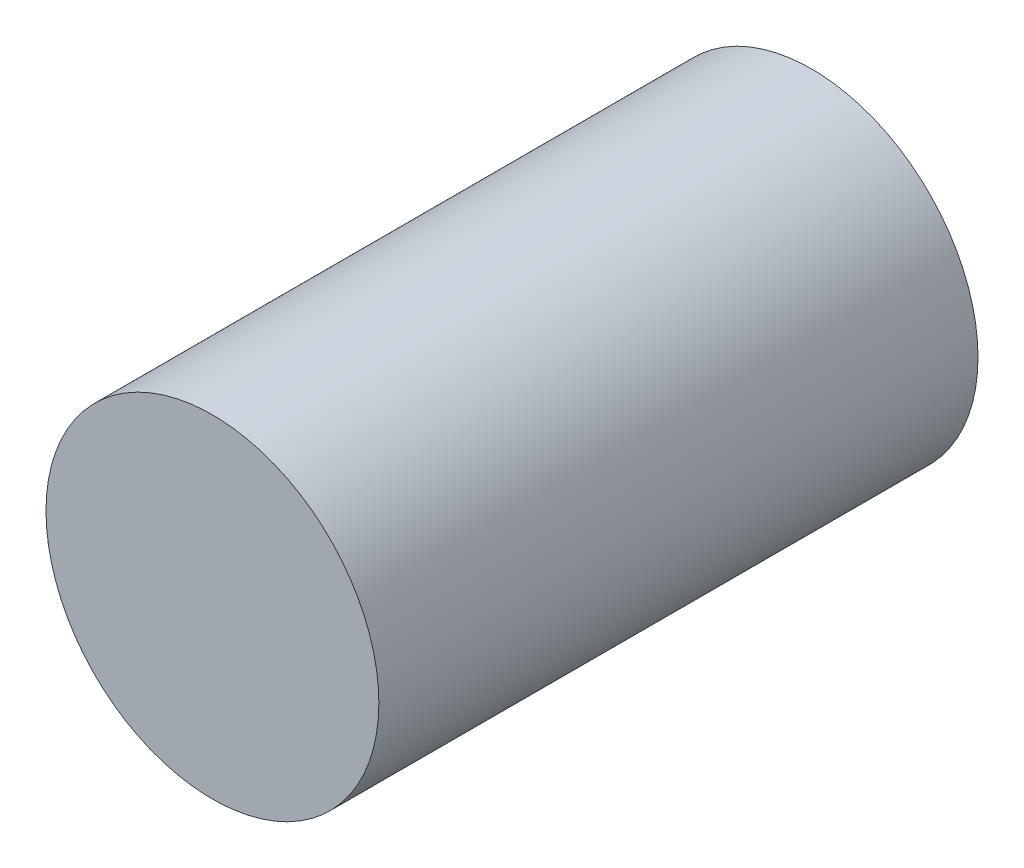
ISO-10303-21;
HEADER;
FILE_DESCRIPTION(('STEP AP214'),'2;1');
FILE_NAME('part.step','',(''),(''),'','','');
FILE_SCHEMA(('AUTOMOTIVE_DESIGN { 1 0 10303 214 1 1 1 1 }'));
ENDSEC;
DATA;
#1=APPLICATION_CONTEXT('core data for automotive mechanical design processes');
#2=APPLICATION_PROTOCOL_DEFINITION('international standard','automotive_design',2000,#1);
#3=PRODUCT_CONTEXT('',#1,'mechanical');
#4=PRODUCT('Part','Part','',(#3));
#5=PRODUCT_RELATED_PRODUCT_CATEGORY('part','',(#4));
#6=PRODUCT_DEFINITION_FORMATION('','',#4);
#7=PRODUCT_DEFINITION_CONTEXT('part definition',#1,'design');
#8=PRODUCT_DEFINITION('design','',#6,#7);
#9=PRODUCT_DEFINITION_SHAPE('','',#8);
#10=(LENGTH_UNIT() NAMED_UNIT(*) SI_UNIT(.MILLI.,.METRE.));
#11=(NAMED_UNIT(*) PLANE_ANGLE_UNIT() SI_UNIT($,.RADIAN.));
#12=(NAMED_UNIT(*) SI_UNIT($,.STERADIAN.) SOLID_ANGLE_UNIT());
#13=UNCERTAINTY_MEASURE_WITH_UNIT(LENGTH_MEASURE(1.E-05),#10,'distance_accuracy_value','');
#14=(GEOMETRIC_REPRESENTATION_CONTEXT(3) GLOBAL_UNCERTAINTY_ASSIGNED_CONTEXT((#13)) GLOBAL_UNIT_ASSIGNED_CONTEXT((#10,
#11,#12)) REPRESENTATION_CONTEXT('',''));
#15=CARTESIAN_POINT('',(0.,0.,0.));
#16=DIRECTION('',(0.,0.,1.));
#17=DIRECTION('',(1.,0.,0.));
#18=AXIS2_PLACEMENT_3D('',#15,#16,#17);
#19=CARTESIAN_POINT('',(0.,0.,11.43));
#20=DIRECTION('',(0.,0.,-1.));
#21=DIRECTION('',(-1.,0.,0.));
#22=AXIS2_PLACEMENT_3D('',#19,#20,#21);
#23=CYLINDRICAL_SURFACE('',#22,3.175);
#24=CARTESIAN_POINT('',(0.,0.,11.43));
#25=DIRECTION('',(0.,0.,1.));
#26=DIRECTION('',(1.,0.,0.));
#27=AXIS2_PLACEMENT_3D('',#24,#25,#26);
#28=CIRCLE('',#27,3.175);
#29=CARTESIAN_POINT('',(3.175,0.,11.43));
#30=VERTEX_POINT('',#29);
#31=EDGE_CURVE('E10',#30,#30,#28,.T.);
#32=ORIENTED_EDGE('',*,*,#31,.F.);
#33=EDGE_LOOP('',(#32));
#34=FACE_BOUND('',#33,.T.);
#35=CARTESIAN_POINT('',(0.,0.,0.));
#36=DIRECTION('',(0.,0.,1.));
#37=DIRECTION('',(1.,0.,0.));
#38=AXIS2_PLACEMENT_3D('',#35,#36,#37);
#39=CIRCLE('',#38,3.175);
#40=CARTESIAN_POINT('',(3.175,0.,0.));
#41=VERTEX_POINT('',#40);
#42=EDGE_CURVE('E34',#41,#41,#39,.T.);
#43=ORIENTED_EDGE('',*,*,#42,.T.);
#44=EDGE_LOOP('',(#43));
#45=FACE_BOUND('',#44,.T.);
#46=ADVANCED_FACE('F31',(#34,#45),#23,.T.);
#47=CARTESIAN_POINT('',(0.,0.,11.43));
#48=DIRECTION('',(0.,0.,1.));
#49=DIRECTION('',(1.,0.,0.));
#50=AXIS2_PLACEMENT_3D('',#47,#48,#49);
#51=PLANE('',#50);
#52=ORIENTED_EDGE('',*,*,#31,.T.);
#53=EDGE_LOOP('',(#52));
#54=FACE_BOUND('',#53,.T.);
#55=ADVANCED_FACE('F46',(#54),#51,.T.);
#56=CARTESIAN_POINT('',(0.,0.,0.));
#57=DIRECTION('',(0.,0.,1.));
#58=DIRECTION('',(1.,0.,0.));
#59=AXIS2_PLACEMENT_3D('',#56,#57,#58);
#60=PLANE('',#59);
#61=ORIENTED_EDGE('',*,*,#42,.F.);
#62=EDGE_LOOP('',(#61));
#63=FACE_BOUND('',#62,.T.);
#64=ADVANCED_FACE('F44',(#63),#60,.F.);
#65=CLOSED_SHELL('',(#46,#55,#64));
#66=MANIFOLD_SOLID_BREP('B2',#65);
#67=ADVANCED_BREP_SHAPE_REPRESENTATION('',(#18,#66),#14);
#68=SHAPE_DEFINITION_REPRESENTATION(#9,#67);
ENDSEC;
END-ISO-10303-21;
